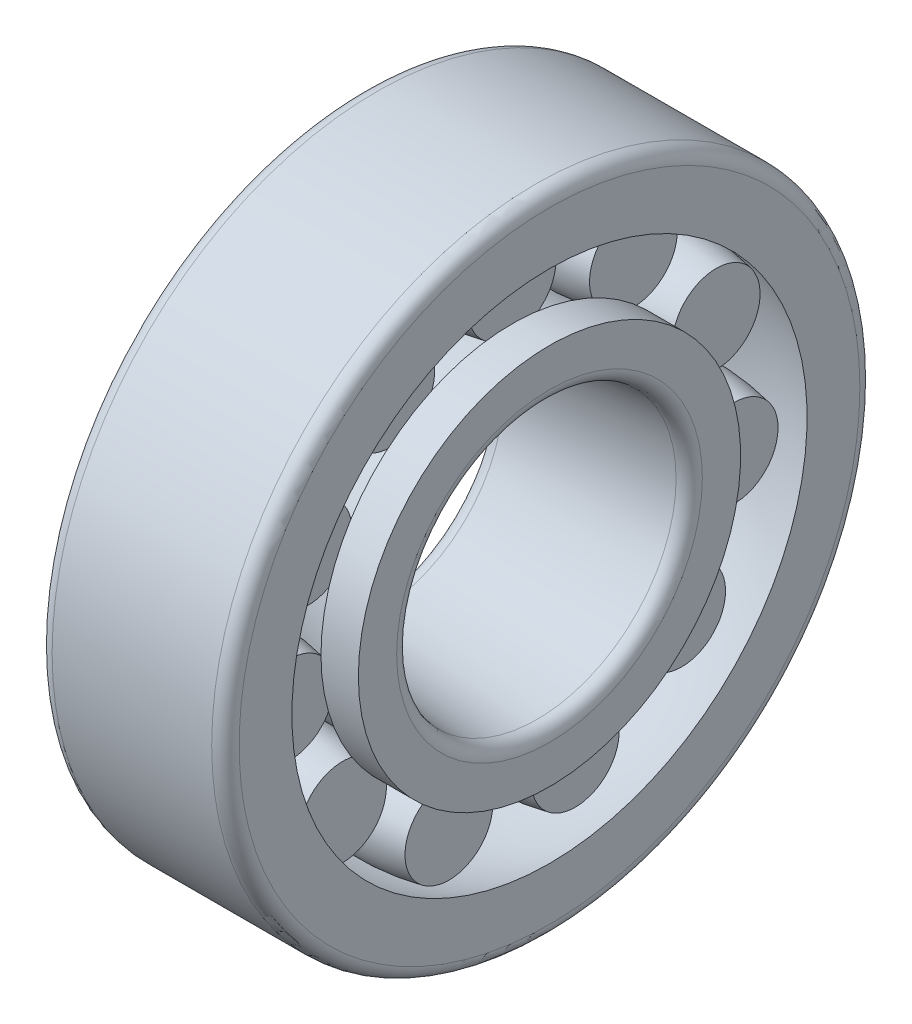
ISO-10303-21;
HEADER;
FILE_DESCRIPTION(('STEP AP214'),'2;1');
FILE_NAME('part.step','',(''),(''),'','','');
FILE_SCHEMA(('AUTOMOTIVE_DESIGN { 1 0 10303 214 1 1 1 1 }'));
ENDSEC;
DATA;
#1=APPLICATION_CONTEXT('core data for automotive mechanical design processes');
#2=APPLICATION_PROTOCOL_DEFINITION('international standard','automotive_design',2000,#1);
#3=PRODUCT_CONTEXT('',#1,'mechanical');
#4=PRODUCT('Part','Part','',(#3));
#5=PRODUCT_RELATED_PRODUCT_CATEGORY('part','',(#4));
#6=PRODUCT_DEFINITION_FORMATION('','',#4);
#7=PRODUCT_DEFINITION_CONTEXT('part definition',#1,'design');
#8=PRODUCT_DEFINITION('design','',#6,#7);
#9=PRODUCT_DEFINITION_SHAPE('','',#8);
#10=(LENGTH_UNIT() NAMED_UNIT(*) SI_UNIT(.MILLI.,.METRE.));
#11=(NAMED_UNIT(*) PLANE_ANGLE_UNIT() SI_UNIT($,.RADIAN.));
#12=(NAMED_UNIT(*) SI_UNIT($,.STERADIAN.) SOLID_ANGLE_UNIT());
#13=UNCERTAINTY_MEASURE_WITH_UNIT(LENGTH_MEASURE(1.E-05),#10,'distance_accuracy_value','');
#14=(GEOMETRIC_REPRESENTATION_CONTEXT(3) GLOBAL_UNCERTAINTY_ASSIGNED_CONTEXT((#13)) GLOBAL_UNIT_ASSIGNED_CONTEXT((#10,
#11,#12)) REPRESENTATION_CONTEXT('',''));
#15=CARTESIAN_POINT('',(0.,0.,0.));
#16=DIRECTION('',(0.,0.,1.));
#17=DIRECTION('',(1.,0.,0.));
#18=AXIS2_PLACEMENT_3D('',#15,#16,#17);
#19=CARTESIAN_POINT('',(3.00000000000001,12.1813372561274,-7.82847010423958));
#20=DIRECTION('',(1.,0.,0.));
#21=DIRECTION('',(0.,0.841253532831188,-0.540640817455586));
#22=AXIS2_PLACEMENT_3D('',#19,#20,#21);
#23=PLANE('',#22);
#24=CARTESIAN_POINT('',(3.00000000000001,15.1425635909614,-9.73153471420055));
#25=DIRECTION('',(1.,0.,0.));
#26=DIRECTION('',(0.,0.841253532831188,-0.540640817455586));
#27=AXIS2_PLACEMENT_3D('',#24,#25,#26);
#28=CIRCLE('',#27,3.52001652209197);
#29=CARTESIAN_POINT('',(3.00000000000001,18.1037899257954,-11.6345993241615));
#30=VERTEX_POINT('',#29);
#31=EDGE_CURVE('E11',#30,#30,#28,.T.);
#32=ORIENTED_EDGE('',*,*,#31,.F.);
#33=EDGE_LOOP('',(#32));
#34=FACE_BOUND('',#33,.T.);
#35=ADVANCED_FACE('F43',(#34),#23,.F.);
#36=CARTESIAN_POINT('',(7.5,15.1425635909614,-9.73153471420055));
#37=DIRECTION('',(1.,0.,0.));
#38=DIRECTION('',(0.,0.841253532831188,-0.540640817455586));
#39=AXIS2_PLACEMENT_3D('',#36,#37,#38);
#40=DEGENERATE_TOROIDAL_SURFACE('',#39,18.,21.9854750030813,.F.);
#41=CARTESIAN_POINT('',(12.,15.1425635909614,-9.73153471420055));
#42=DIRECTION('',(1.,0.,0.));
#43=DIRECTION('',(0.,0.841253532831188,-0.540640817455586));
#44=AXIS2_PLACEMENT_3D('',#41,#42,#43);
#45=CIRCLE('',#44,3.52001652209196);
#46=CARTESIAN_POINT('',(12.,18.1037899257954,-11.6345993241615));
#47=VERTEX_POINT('',#46);
#48=EDGE_CURVE('E49',#47,#47,#45,.T.);
#49=ORIENTED_EDGE('',*,*,#48,.F.);
#50=EDGE_LOOP('',(#49));
#51=FACE_BOUND('',#50,.T.);
#52=ORIENTED_EDGE('',*,*,#31,.T.);
#53=EDGE_LOOP('',(#52));
#54=FACE_BOUND('',#53,.T.);
#55=ADVANCED_FACE('F57',(#51,#54),#40,.F.);
#56=CARTESIAN_POINT('',(12.,12.1813372561274,-7.82847010423959));
#57=DIRECTION('',(-1.,0.,0.));
#58=DIRECTION('',(0.,-0.841253532831188,0.540640817455586));
#59=AXIS2_PLACEMENT_3D('',#56,#57,#58);
#60=PLANE('',#59);
#61=ORIENTED_EDGE('',*,*,#48,.T.);
#62=EDGE_LOOP('',(#61));
#63=FACE_BOUND('',#62,.T.);
#64=ADVANCED_FACE('F55',(#63),#60,.F.);
#65=CLOSED_SHELL('',(#35,#55,#64));
#66=MANIFOLD_SOLID_BREP('B2',#65);
#67=CARTESIAN_POINT('',(3.00000000000001,6.01520252474243,-13.1714562637099));
#68=DIRECTION('',(1.,0.,0.));
#69=DIRECTION('',(0.,0.415415013001897,-0.909631995354513));
#70=AXIS2_PLACEMENT_3D('',#67,#68,#69);
#71=PLANE('',#70);
#72=CARTESIAN_POINT('',(3.00000000000001,7.47747023403415,-16.3733759163812));
#73=DIRECTION('',(1.,0.,0.));
#74=DIRECTION('',(0.,0.415415013001897,-0.909631995354513));
#75=AXIS2_PLACEMENT_3D('',#72,#73,#74);
#76=CIRCLE('',#75,3.52001652209197);
#77=CARTESIAN_POINT('',(3.00000000000001,8.93973794332588,-19.5752955690526));
#78=VERTEX_POINT('',#77);
#79=EDGE_CURVE('E42',#78,#78,#76,.T.);
#80=ORIENTED_EDGE('',*,*,#79,.F.);
#81=EDGE_LOOP('',(#80));
#82=FACE_BOUND('',#81,.T.);
#83=ADVANCED_FACE('F97',(#82),#71,.F.);
#84=CARTESIAN_POINT('',(7.5,7.47747023403415,-16.3733759163812));
#85=DIRECTION('',(1.,0.,0.));
#86=DIRECTION('',(0.,0.415415013001897,-0.909631995354513));
#87=AXIS2_PLACEMENT_3D('',#84,#85,#86);
#88=DEGENERATE_TOROIDAL_SURFACE('',#87,18.,21.9854750030813,.F.);
#89=CARTESIAN_POINT('',(12.,7.47747023403415,-16.3733759163812));
#90=DIRECTION('',(1.,0.,0.));
#91=DIRECTION('',(0.,0.415415013001897,-0.909631995354513));
#92=AXIS2_PLACEMENT_3D('',#89,#90,#91);
#93=CIRCLE('',#92,3.52001652209196);
#94=CARTESIAN_POINT('',(12.,8.93973794332588,-19.5752955690526));
#95=VERTEX_POINT('',#94);
#96=EDGE_CURVE('E103',#95,#95,#93,.T.);
#97=ORIENTED_EDGE('',*,*,#96,.F.);
#98=EDGE_LOOP('',(#97));
#99=FACE_BOUND('',#98,.T.);
#100=ORIENTED_EDGE('',*,*,#79,.T.);
#101=EDGE_LOOP('',(#100));
#102=FACE_BOUND('',#101,.T.);
#103=ADVANCED_FACE('F111',(#99,#102),#88,.F.);
#104=CARTESIAN_POINT('',(12.,6.01520252474243,-13.1714562637099));
#105=DIRECTION('',(-1.,0.,0.));
#106=DIRECTION('',(0.,-0.415415013001897,0.909631995354513));
#107=AXIS2_PLACEMENT_3D('',#104,#105,#106);
#108=PLANE('',#107);
#109=ORIENTED_EDGE('',*,*,#96,.T.);
#110=EDGE_LOOP('',(#109));
#111=FACE_BOUND('',#110,.T.);
#112=ADVANCED_FACE('F109',(#111),#108,.F.);
#113=CLOSED_SHELL('',(#83,#103,#112));
#114=MANIFOLD_SOLID_BREP('B6',#113);
#115=CARTESIAN_POINT('',(3.00000000000001,-2.06071650685817,-14.332598124515));
#116=DIRECTION('',(1.,0.,0.));
#117=DIRECTION('',(0.,-0.142314838273275,-0.989821441880934));
#118=AXIS2_PLACEMENT_3D('',#115,#116,#117);
#119=PLANE('',#118);
#120=CARTESIAN_POINT('',(3.00000000000001,-2.56166708891894,-17.8167859538568));
#121=DIRECTION('',(1.,0.,0.));
#122=DIRECTION('',(0.,-0.142314838273275,-0.989821441880934));
#123=AXIS2_PLACEMENT_3D('',#120,#121,#122);
#124=CIRCLE('',#123,3.52001652209197);
#125=CARTESIAN_POINT('',(3.00000000000001,-3.06261767097972,-21.3009737831986));
#126=VERTEX_POINT('',#125);
#127=EDGE_CURVE('E96',#126,#126,#124,.T.);
#128=ORIENTED_EDGE('',*,*,#127,.F.);
#129=EDGE_LOOP('',(#128));
#130=FACE_BOUND('',#129,.T.);
#131=ADVANCED_FACE('F151',(#130),#119,.F.);
#132=CARTESIAN_POINT('',(7.5,-2.56166708891894,-17.8167859538568));
#133=DIRECTION('',(1.,0.,0.));
#134=DIRECTION('',(0.,-0.142314838273275,-0.989821441880934));
#135=AXIS2_PLACEMENT_3D('',#132,#133,#134);
#136=DEGENERATE_TOROIDAL_SURFACE('',#135,18.,21.9854750030813,.F.);
#137=CARTESIAN_POINT('',(12.,-2.56166708891894,-17.8167859538568));
#138=DIRECTION('',(1.,0.,0.));
#139=DIRECTION('',(0.,-0.142314838273275,-0.989821441880934));
#140=AXIS2_PLACEMENT_3D('',#137,#138,#139);
#141=CIRCLE('',#140,3.52001652209196);
#142=CARTESIAN_POINT('',(12.,-3.06261767097972,-21.3009737831986));
#143=VERTEX_POINT('',#142);
#144=EDGE_CURVE('E157',#143,#143,#141,.T.);
#145=ORIENTED_EDGE('',*,*,#144,.F.);
#146=EDGE_LOOP('',(#145));
#147=FACE_BOUND('',#146,.T.);
#148=ORIENTED_EDGE('',*,*,#127,.T.);
#149=EDGE_LOOP('',(#148));
#150=FACE_BOUND('',#149,.T.);
#151=ADVANCED_FACE('F165',(#147,#150),#136,.F.);
#152=CARTESIAN_POINT('',(12.,-2.06071650685817,-14.332598124515));
#153=DIRECTION('',(-1.,0.,0.));
#154=DIRECTION('',(0.,0.142314838273275,0.989821441880934));
#155=AXIS2_PLACEMENT_3D('',#152,#153,#154);
#156=PLANE('',#155);
#157=ORIENTED_EDGE('',*,*,#144,.T.);
#158=EDGE_LOOP('',(#157));
#159=FACE_BOUND('',#158,.T.);
#160=ADVANCED_FACE('F163',(#159),#156,.F.);
#161=CLOSED_SHELL('',(#131,#151,#160));
#162=MANIFOLD_SOLID_BREP('B37',#161);
#163=CARTESIAN_POINT('',(3.00000000000001,-9.48237260785836,-10.9432413500858));
#164=DIRECTION('',(1.,0.,0.));
#165=DIRECTION('',(0.,-0.654860733945278,-0.755749574354264));
#166=AXIS2_PLACEMENT_3D('',#163,#164,#165);
#167=PLANE('',#166);
#168=CARTESIAN_POINT('',(3.00000000000001,-11.787493211015,-13.6034923383768));
#169=DIRECTION('',(1.,0.,0.));
#170=DIRECTION('',(0.,-0.654860733945278,-0.755749574354264));
#171=AXIS2_PLACEMENT_3D('',#168,#169,#170);
#172=CIRCLE('',#171,3.52001652209197);
#173=CARTESIAN_POINT('',(3.00000000000001,-14.0926138141717,-16.2637433266677));
#174=VERTEX_POINT('',#173);
#175=EDGE_CURVE('E150',#174,#174,#172,.T.);
#176=ORIENTED_EDGE('',*,*,#175,.F.);
#177=EDGE_LOOP('',(#176));
#178=FACE_BOUND('',#177,.T.);
#179=ADVANCED_FACE('F205',(#178),#167,.F.);
#180=CARTESIAN_POINT('',(7.5,-11.787493211015,-13.6034923383768));
#181=DIRECTION('',(1.,0.,0.));
#182=DIRECTION('',(0.,-0.654860733945278,-0.755749574354264));
#183=AXIS2_PLACEMENT_3D('',#180,#181,#182);
#184=DEGENERATE_TOROIDAL_SURFACE('',#183,18.,21.9854750030813,.F.);
#185=CARTESIAN_POINT('',(12.,-11.787493211015,-13.6034923383768));
#186=DIRECTION('',(1.,0.,0.));
#187=DIRECTION('',(0.,-0.654860733945278,-0.755749574354264));
#188=AXIS2_PLACEMENT_3D('',#185,#186,#187);
#189=CIRCLE('',#188,3.52001652209196);
#190=CARTESIAN_POINT('',(12.,-14.0926138141717,-16.2637433266677));
#191=VERTEX_POINT('',#190);
#192=EDGE_CURVE('E211',#191,#191,#189,.T.);
#193=ORIENTED_EDGE('',*,*,#192,.F.);
#194=EDGE_LOOP('',(#193));
#195=FACE_BOUND('',#194,.T.);
#196=ORIENTED_EDGE('',*,*,#175,.T.);
#197=EDGE_LOOP('',(#196));
#198=FACE_BOUND('',#197,.T.);
#199=ADVANCED_FACE('F219',(#195,#198),#184,.F.);
#200=CARTESIAN_POINT('',(12.,-9.48237260785836,-10.9432413500858));
#201=DIRECTION('',(-1.,0.,0.));
#202=DIRECTION('',(0.,0.654860733945278,0.755749574354264));
#203=AXIS2_PLACEMENT_3D('',#200,#201,#202);
#204=PLANE('',#203);
#205=ORIENTED_EDGE('',*,*,#192,.T.);
#206=EDGE_LOOP('',(#205));
#207=FACE_BOUND('',#206,.T.);
#208=ADVANCED_FACE('F217',(#207),#204,.F.);
#209=CLOSED_SHELL('',(#179,#199,#208));
#210=MANIFOLD_SOLID_BREP('B91',#209);
#211=CARTESIAN_POINT('',(3.00000000000001,-13.8934424051067,-4.0794827682528));
#212=DIRECTION('',(1.,0.,0.));
#213=DIRECTION('',(0.,-0.959492973614495,-0.281732556841437));
#214=AXIS2_PLACEMENT_3D('',#211,#212,#213);
#215=PLANE('',#214);
#216=CARTESIAN_POINT('',(3.00000000000001,-17.2708735250609,-5.07118602314587));
#217=DIRECTION('',(1.,0.,0.));
#218=DIRECTION('',(0.,-0.959492973614495,-0.281732556841437));
#219=AXIS2_PLACEMENT_3D('',#216,#217,#218);
#220=CIRCLE('',#219,3.52001652209197);
#221=CARTESIAN_POINT('',(3.00000000000001,-20.6483046450151,-6.06288927803894));
#222=VERTEX_POINT('',#221);
#223=EDGE_CURVE('E204',#222,#222,#220,.T.);
#224=ORIENTED_EDGE('',*,*,#223,.F.);
#225=EDGE_LOOP('',(#224));
#226=FACE_BOUND('',#225,.T.);
#227=ADVANCED_FACE('F259',(#226),#215,.F.);
#228=CARTESIAN_POINT('',(7.5,-17.2708735250609,-5.07118602314587));
#229=DIRECTION('',(1.,0.,0.));
#230=DIRECTION('',(0.,-0.959492973614495,-0.281732556841437));
#231=AXIS2_PLACEMENT_3D('',#228,#229,#230);
#232=DEGENERATE_TOROIDAL_SURFACE('',#231,18.,21.9854750030813,.F.);
#233=CARTESIAN_POINT('',(12.,-17.2708735250609,-5.07118602314587));
#234=DIRECTION('',(1.,0.,0.));
#235=DIRECTION('',(0.,-0.959492973614495,-0.281732556841437));
#236=AXIS2_PLACEMENT_3D('',#233,#234,#235);
#237=CIRCLE('',#236,3.52001652209196);
#238=CARTESIAN_POINT('',(12.,-20.6483046450151,-6.06288927803894));
#239=VERTEX_POINT('',#238);
#240=EDGE_CURVE('E265',#239,#239,#237,.T.);
#241=ORIENTED_EDGE('',*,*,#240,.F.);
#242=EDGE_LOOP('',(#241));
#243=FACE_BOUND('',#242,.T.);
#244=ORIENTED_EDGE('',*,*,#223,.T.);
#245=EDGE_LOOP('',(#244));
#246=FACE_BOUND('',#245,.T.);
#247=ADVANCED_FACE('F273',(#243,#246),#232,.F.);
#248=CARTESIAN_POINT('',(12.,-13.8934424051067,-4.0794827682528));
#249=DIRECTION('',(-1.,0.,0.));
#250=DIRECTION('',(0.,0.959492973614495,0.281732556841437));
#251=AXIS2_PLACEMENT_3D('',#248,#249,#250);
#252=PLANE('',#251);
#253=ORIENTED_EDGE('',*,*,#240,.T.);
#254=EDGE_LOOP('',(#253));
#255=FACE_BOUND('',#254,.T.);
#256=ADVANCED_FACE('F271',(#255),#252,.F.);
#257=CLOSED_SHELL('',(#227,#247,#256));
#258=MANIFOLD_SOLID_BREP('B145',#257);
#259=CARTESIAN_POINT('',(3.00000000000001,-13.8934424051068,4.0794827682526));
#260=DIRECTION('',(1.,0.,0.));
#261=DIRECTION('',(0.,-0.959492973614499,0.281732556841423));
#262=AXIS2_PLACEMENT_3D('',#259,#260,#261);
#263=PLANE('',#262);
#264=CARTESIAN_POINT('',(3.00000000000001,-17.270873525061,5.07118602314562));
#265=DIRECTION('',(1.,0.,0.));
#266=DIRECTION('',(0.,-0.959492973614499,0.281732556841423));
#267=AXIS2_PLACEMENT_3D('',#264,#265,#266);
#268=CIRCLE('',#267,3.52001652209197);
#269=CARTESIAN_POINT('',(3.00000000000001,-20.6483046450152,6.06288927803864));
#270=VERTEX_POINT('',#269);
#271=EDGE_CURVE('E258',#270,#270,#268,.T.);
#272=ORIENTED_EDGE('',*,*,#271,.F.);
#273=EDGE_LOOP('',(#272));
#274=FACE_BOUND('',#273,.T.);
#275=ADVANCED_FACE('F313',(#274),#263,.F.);
#276=CARTESIAN_POINT('',(7.5,-17.270873525061,5.07118602314562));
#277=DIRECTION('',(1.,0.,0.));
#278=DIRECTION('',(0.,-0.959492973614499,0.281732556841423));
#279=AXIS2_PLACEMENT_3D('',#276,#277,#278);
#280=DEGENERATE_TOROIDAL_SURFACE('',#279,18.,21.9854750030813,.F.);
#281=CARTESIAN_POINT('',(12.,-17.270873525061,5.07118602314562));
#282=DIRECTION('',(1.,0.,0.));
#283=DIRECTION('',(0.,-0.959492973614499,0.281732556841423));
#284=AXIS2_PLACEMENT_3D('',#281,#282,#283);
#285=CIRCLE('',#284,3.52001652209196);
#286=CARTESIAN_POINT('',(12.,-20.6483046450152,6.06288927803864));
#287=VERTEX_POINT('',#286);
#288=EDGE_CURVE('E319',#287,#287,#285,.T.);
#289=ORIENTED_EDGE('',*,*,#288,.F.);
#290=EDGE_LOOP('',(#289));
#291=FACE_BOUND('',#290,.T.);
#292=ORIENTED_EDGE('',*,*,#271,.T.);
#293=EDGE_LOOP('',(#292));
#294=FACE_BOUND('',#293,.T.);
#295=ADVANCED_FACE('F327',(#291,#294),#280,.F.);
#296=CARTESIAN_POINT('',(12.,-13.8934424051068,4.0794827682526));
#297=DIRECTION('',(-1.,0.,0.));
#298=DIRECTION('',(0.,0.959492973614499,-0.281732556841423));
#299=AXIS2_PLACEMENT_3D('',#296,#297,#298);
#300=PLANE('',#299);
#301=ORIENTED_EDGE('',*,*,#288,.T.);
#302=EDGE_LOOP('',(#301));
#303=FACE_BOUND('',#302,.T.);
#304=ADVANCED_FACE('F325',(#303),#300,.F.);
#305=CLOSED_SHELL('',(#275,#295,#304));
#306=MANIFOLD_SOLID_BREP('B199',#305);
#307=CARTESIAN_POINT('',(3.00000000000001,-9.48237260785852,10.9432413500856));
#308=DIRECTION('',(1.,0.,0.));
#309=DIRECTION('',(0.,-0.654860733945289,0.755749574354255));
#310=AXIS2_PLACEMENT_3D('',#307,#308,#309);
#311=PLANE('',#310);
#312=CARTESIAN_POINT('',(3.00000000000001,-11.7874932110152,13.6034923383766));
#313=DIRECTION('',(1.,0.,0.));
#314=DIRECTION('',(0.,-0.654860733945289,0.755749574354255));
#315=AXIS2_PLACEMENT_3D('',#312,#313,#314);
#316=CIRCLE('',#315,3.52001652209197);
#317=CARTESIAN_POINT('',(3.00000000000001,-14.0926138141719,16.2637433266675));
#318=VERTEX_POINT('',#317);
#319=EDGE_CURVE('E312',#318,#318,#316,.T.);
#320=ORIENTED_EDGE('',*,*,#319,.F.);
#321=EDGE_LOOP('',(#320));
#322=FACE_BOUND('',#321,.T.);
#323=ADVANCED_FACE('F367',(#322),#311,.F.);
#324=CARTESIAN_POINT('',(7.5,-11.7874932110152,13.6034923383766));
#325=DIRECTION('',(1.,0.,0.));
#326=DIRECTION('',(0.,-0.654860733945289,0.755749574354255));
#327=AXIS2_PLACEMENT_3D('',#324,#325,#326);
#328=DEGENERATE_TOROIDAL_SURFACE('',#327,18.,21.9854750030813,.F.);
#329=CARTESIAN_POINT('',(12.,-11.7874932110152,13.6034923383766));
#330=DIRECTION('',(1.,0.,0.));
#331=DIRECTION('',(0.,-0.654860733945289,0.755749574354255));
#332=AXIS2_PLACEMENT_3D('',#329,#330,#331);
#333=CIRCLE('',#332,3.52001652209196);
#334=CARTESIAN_POINT('',(12.,-14.0926138141719,16.2637433266675));
#335=VERTEX_POINT('',#334);
#336=EDGE_CURVE('E373',#335,#335,#333,.T.);
#337=ORIENTED_EDGE('',*,*,#336,.F.);
#338=EDGE_LOOP('',(#337));
#339=FACE_BOUND('',#338,.T.);
#340=ORIENTED_EDGE('',*,*,#319,.T.);
#341=EDGE_LOOP('',(#340));
#342=FACE_BOUND('',#341,.T.);
#343=ADVANCED_FACE('F381',(#339,#342),#328,.F.);
#344=CARTESIAN_POINT('',(12.,-9.48237260785852,10.9432413500856));
#345=DIRECTION('',(-1.,0.,0.));
#346=DIRECTION('',(0.,0.654860733945289,-0.755749574354255));
#347=AXIS2_PLACEMENT_3D('',#344,#345,#346);
#348=PLANE('',#347);
#349=ORIENTED_EDGE('',*,*,#336,.T.);
#350=EDGE_LOOP('',(#349));
#351=FACE_BOUND('',#350,.T.);
#352=ADVANCED_FACE('F379',(#351),#348,.F.);
#353=CLOSED_SHELL('',(#323,#343,#352));
#354=MANIFOLD_SOLID_BREP('B253',#353);
#355=CARTESIAN_POINT('',(3.00000000000001,-2.06071650685838,14.332598124515));
#356=DIRECTION('',(1.,0.,0.));
#357=DIRECTION('',(0.,-0.142314838273289,0.989821441880932));
#358=AXIS2_PLACEMENT_3D('',#355,#356,#357);
#359=PLANE('',#358);
#360=CARTESIAN_POINT('',(3.00000000000001,-2.5616670889192,17.8167859538568));
#361=DIRECTION('',(1.,0.,0.));
#362=DIRECTION('',(0.,-0.142314838273289,0.989821441880932));
#363=AXIS2_PLACEMENT_3D('',#360,#361,#362);
#364=CIRCLE('',#363,3.52001652209197);
#365=CARTESIAN_POINT('',(3.00000000000001,-3.06261767098002,21.3009737831986));
#366=VERTEX_POINT('',#365);
#367=EDGE_CURVE('E366',#366,#366,#364,.T.);
#368=ORIENTED_EDGE('',*,*,#367,.F.);
#369=EDGE_LOOP('',(#368));
#370=FACE_BOUND('',#369,.T.);
#371=ADVANCED_FACE('F421',(#370),#359,.F.);
#372=CARTESIAN_POINT('',(7.5,-2.5616670889192,17.8167859538568));
#373=DIRECTION('',(1.,0.,0.));
#374=DIRECTION('',(0.,-0.142314838273289,0.989821441880932));
#375=AXIS2_PLACEMENT_3D('',#372,#373,#374);
#376=DEGENERATE_TOROIDAL_SURFACE('',#375,18.,21.9854750030813,.F.);
#377=CARTESIAN_POINT('',(12.,-2.5616670889192,17.8167859538568));
#378=DIRECTION('',(1.,0.,0.));
#379=DIRECTION('',(0.,-0.142314838273289,0.989821441880932));
#380=AXIS2_PLACEMENT_3D('',#377,#378,#379);
#381=CIRCLE('',#380,3.52001652209196);
#382=CARTESIAN_POINT('',(12.,-3.06261767098002,21.3009737831986));
#383=VERTEX_POINT('',#382);
#384=EDGE_CURVE('E427',#383,#383,#381,.T.);
#385=ORIENTED_EDGE('',*,*,#384,.F.);
#386=EDGE_LOOP('',(#385));
#387=FACE_BOUND('',#386,.T.);
#388=ORIENTED_EDGE('',*,*,#367,.T.);
#389=EDGE_LOOP('',(#388));
#390=FACE_BOUND('',#389,.T.);
#391=ADVANCED_FACE('F435',(#387,#390),#376,.F.);
#392=CARTESIAN_POINT('',(12.,-2.06071650685838,14.332598124515));
#393=DIRECTION('',(-1.,0.,0.));
#394=DIRECTION('',(0.,0.142314838273289,-0.989821441880932));
#395=AXIS2_PLACEMENT_3D('',#392,#393,#394);
#396=PLANE('',#395);
#397=ORIENTED_EDGE('',*,*,#384,.T.);
#398=EDGE_LOOP('',(#397));
#399=FACE_BOUND('',#398,.T.);
#400=ADVANCED_FACE('F433',(#399),#396,.F.);
#401=CLOSED_SHELL('',(#371,#391,#400));
#402=MANIFOLD_SOLID_BREP('B307',#401);
#403=CARTESIAN_POINT('',(3.00000000000001,6.01520252474223,13.17145626371));
#404=DIRECTION('',(1.,0.,0.));
#405=DIRECTION('',(0.,0.415415013001884,0.909631995354519));
#406=AXIS2_PLACEMENT_3D('',#403,#404,#405);
#407=PLANE('',#406);
#408=CARTESIAN_POINT('',(3.00000000000001,7.47747023403391,16.3733759163813));
#409=DIRECTION('',(1.,0.,0.));
#410=DIRECTION('',(0.,0.415415013001884,0.909631995354519));
#411=AXIS2_PLACEMENT_3D('',#408,#409,#410);
#412=CIRCLE('',#411,3.52001652209197);
#413=CARTESIAN_POINT('',(3.00000000000001,8.93973794332559,19.5752955690527));
#414=VERTEX_POINT('',#413);
#415=EDGE_CURVE('E420',#414,#414,#412,.T.);
#416=ORIENTED_EDGE('',*,*,#415,.F.);
#417=EDGE_LOOP('',(#416));
#418=FACE_BOUND('',#417,.T.);
#419=ADVANCED_FACE('F475',(#418),#407,.F.);
#420=CARTESIAN_POINT('',(7.5,7.47747023403391,16.3733759163814));
#421=DIRECTION('',(1.,0.,0.));
#422=DIRECTION('',(0.,0.415415013001884,0.909631995354519));
#423=AXIS2_PLACEMENT_3D('',#420,#421,#422);
#424=DEGENERATE_TOROIDAL_SURFACE('',#423,18.,21.9854750030813,.F.);
#425=CARTESIAN_POINT('',(12.,7.47747023403391,16.3733759163814));
#426=DIRECTION('',(1.,0.,0.));
#427=DIRECTION('',(0.,0.415415013001884,0.909631995354519));
#428=AXIS2_PLACEMENT_3D('',#425,#426,#427);
#429=CIRCLE('',#428,3.52001652209196);
#430=CARTESIAN_POINT('',(12.,8.93973794332559,19.5752955690527));
#431=VERTEX_POINT('',#430);
#432=EDGE_CURVE('E481',#431,#431,#429,.T.);
#433=ORIENTED_EDGE('',*,*,#432,.F.);
#434=EDGE_LOOP('',(#433));
#435=FACE_BOUND('',#434,.T.);
#436=ORIENTED_EDGE('',*,*,#415,.T.);
#437=EDGE_LOOP('',(#436));
#438=FACE_BOUND('',#437,.T.);
#439=ADVANCED_FACE('F489',(#435,#438),#424,.F.);
#440=CARTESIAN_POINT('',(12.,6.01520252474223,13.17145626371));
#441=DIRECTION('',(-1.,0.,0.));
#442=DIRECTION('',(0.,-0.415415013001884,-0.909631995354519));
#443=AXIS2_PLACEMENT_3D('',#440,#441,#442);
#444=PLANE('',#443);
#445=ORIENTED_EDGE('',*,*,#432,.T.);
#446=EDGE_LOOP('',(#445));
#447=FACE_BOUND('',#446,.T.);
#448=ADVANCED_FACE('F487',(#447),#444,.F.);
#449=CLOSED_SHELL('',(#419,#439,#448));
#450=MANIFOLD_SOLID_BREP('B361',#449);
#451=CARTESIAN_POINT('',(3.00000000000001,12.1813372561273,7.82847010423976));
#452=DIRECTION('',(1.,0.,0.));
#453=DIRECTION('',(0.,0.841253532831181,0.540640817455599));
#454=AXIS2_PLACEMENT_3D('',#451,#452,#453);
#455=PLANE('',#454);
#456=CARTESIAN_POINT('',(3.00000000000001,15.1425635909613,9.73153471420078));
#457=DIRECTION('',(1.,0.,0.));
#458=DIRECTION('',(0.,0.841253532831181,0.540640817455599));
#459=AXIS2_PLACEMENT_3D('',#456,#457,#458);
#460=CIRCLE('',#459,3.52001652209197);
#461=CARTESIAN_POINT('',(3.00000000000001,18.1037899257952,11.6345993241618));
#462=VERTEX_POINT('',#461);
#463=EDGE_CURVE('E474',#462,#462,#460,.T.);
#464=ORIENTED_EDGE('',*,*,#463,.F.);
#465=EDGE_LOOP('',(#464));
#466=FACE_BOUND('',#465,.T.);
#467=ADVANCED_FACE('F529',(#466),#455,.F.);
#468=CARTESIAN_POINT('',(7.5,15.1425635909613,9.73153471420078));
#469=DIRECTION('',(1.,0.,0.));
#470=DIRECTION('',(0.,0.841253532831181,0.540640817455599));
#471=AXIS2_PLACEMENT_3D('',#468,#469,#470);
#472=DEGENERATE_TOROIDAL_SURFACE('',#471,18.,21.9854750030813,.F.);
#473=CARTESIAN_POINT('',(12.,15.1425635909613,9.73153471420078));
#474=DIRECTION('',(1.,0.,0.));
#475=DIRECTION('',(0.,0.841253532831181,0.540640817455599));
#476=AXIS2_PLACEMENT_3D('',#473,#474,#475);
#477=CIRCLE('',#476,3.52001652209196);
#478=CARTESIAN_POINT('',(12.,18.1037899257952,11.6345993241618));
#479=VERTEX_POINT('',#478);
#480=EDGE_CURVE('E535',#479,#479,#477,.T.);
#481=ORIENTED_EDGE('',*,*,#480,.F.);
#482=EDGE_LOOP('',(#481));
#483=FACE_BOUND('',#482,.T.);
#484=ORIENTED_EDGE('',*,*,#463,.T.);
#485=EDGE_LOOP('',(#484));
#486=FACE_BOUND('',#485,.T.);
#487=ADVANCED_FACE('F543',(#483,#486),#472,.F.);
#488=CARTESIAN_POINT('',(12.,12.1813372561273,7.82847010423976));
#489=DIRECTION('',(-1.,0.,0.));
#490=DIRECTION('',(0.,-0.841253532831181,-0.540640817455599));
#491=AXIS2_PLACEMENT_3D('',#488,#489,#490);
#492=PLANE('',#491);
#493=ORIENTED_EDGE('',*,*,#480,.T.);
#494=EDGE_LOOP('',(#493));
#495=FACE_BOUND('',#494,.T.);
#496=ADVANCED_FACE('F541',(#495),#492,.F.);
#497=CLOSED_SHELL('',(#467,#487,#496));
#498=MANIFOLD_SOLID_BREP('B415',#497);
#499=CARTESIAN_POINT('',(3.00000000000001,14.479983477908,0.));
#500=DIRECTION('',(1.,0.,0.));
#501=DIRECTION('',(0.,1.,0.));
#502=AXIS2_PLACEMENT_3D('',#499,#500,#501);
#503=PLANE('',#502);
#504=CARTESIAN_POINT('',(3.00000000000001,18.,0.));
#505=DIRECTION('',(1.,0.,0.));
#506=DIRECTION('',(0.,1.,0.));
#507=AXIS2_PLACEMENT_3D('',#504,#505,#506);
#508=CIRCLE('',#507,3.52001652209197);
#509=CARTESIAN_POINT('',(3.00000000000001,21.520016522092,0.));
#510=VERTEX_POINT('',#509);
#511=EDGE_CURVE('E528',#510,#510,#508,.T.);
#512=ORIENTED_EDGE('',*,*,#511,.F.);
#513=EDGE_LOOP('',(#512));
#514=FACE_BOUND('',#513,.T.);
#515=ADVANCED_FACE('F583',(#514),#503,.F.);
#516=CARTESIAN_POINT('',(7.5,18.,0.));
#517=DIRECTION('',(1.,0.,0.));
#518=DIRECTION('',(0.,1.,0.));
#519=AXIS2_PLACEMENT_3D('',#516,#517,#518);
#520=DEGENERATE_TOROIDAL_SURFACE('',#519,18.,21.9854750030813,.F.);
#521=CARTESIAN_POINT('',(12.,18.,0.));
#522=DIRECTION('',(1.,0.,0.));
#523=DIRECTION('',(0.,1.,0.));
#524=AXIS2_PLACEMENT_3D('',#521,#522,#523);
#525=CIRCLE('',#524,3.52001652209196);
#526=CARTESIAN_POINT('',(12.,21.520016522092,0.));
#527=VERTEX_POINT('',#526);
#528=EDGE_CURVE('E589',#527,#527,#525,.T.);
#529=ORIENTED_EDGE('',*,*,#528,.F.);
#530=EDGE_LOOP('',(#529));
#531=FACE_BOUND('',#530,.T.);
#532=ORIENTED_EDGE('',*,*,#511,.T.);
#533=EDGE_LOOP('',(#532));
#534=FACE_BOUND('',#533,.T.);
#535=ADVANCED_FACE('F597',(#531,#534),#520,.F.);
#536=CARTESIAN_POINT('',(12.,14.479983477908,0.));
#537=DIRECTION('',(-1.,0.,0.));
#538=DIRECTION('',(0.,-1.,0.));
#539=AXIS2_PLACEMENT_3D('',#536,#537,#538);
#540=PLANE('',#539);
#541=ORIENTED_EDGE('',*,*,#528,.T.);
#542=EDGE_LOOP('',(#541));
#543=FACE_BOUND('',#542,.T.);
#544=ADVANCED_FACE('F595',(#543),#540,.F.);
#545=CLOSED_SHELL('',(#515,#535,#544));
#546=MANIFOLD_SOLID_BREP('B469',#545);
#547=CARTESIAN_POINT('',(7.5,0.,0.));
#548=DIRECTION('',(-1.,0.,0.));
#549=DIRECTION('',(0.,0.,1.));
#550=AXIS2_PLACEMENT_3D('',#547,#548,#549);
#551=TOROIDAL_SURFACE('',#550,36.,21.9854750030813);
#552=CARTESIAN_POINT('',(12.,0.,0.));
#553=DIRECTION('',(-1.,0.,0.));
#554=DIRECTION('',(0.,0.,1.));
#555=AXIS2_PLACEMENT_3D('',#552,#553,#554);
#556=CIRCLE('',#555,14.479983477908);
#557=CARTESIAN_POINT('',(12.,0.,14.479983477908));
#558=VERTEX_POINT('',#557);
#559=EDGE_CURVE('E665',#558,#558,#556,.T.);
#560=ORIENTED_EDGE('',*,*,#559,.T.);
#561=EDGE_LOOP('',(#560));
#562=FACE_BOUND('',#561,.T.);
#563=CARTESIAN_POINT('',(3.,0.,0.));
#564=DIRECTION('',(-1.,0.,0.));
#565=DIRECTION('',(0.,0.,1.));
#566=AXIS2_PLACEMENT_3D('',#563,#564,#565);
#567=CIRCLE('',#566,14.479983477908);
#568=CARTESIAN_POINT('',(3.,0.,14.479983477908));
#569=VERTEX_POINT('',#568);
#570=EDGE_CURVE('E650',#569,#569,#567,.T.);
#571=ORIENTED_EDGE('',*,*,#570,.F.);
#572=EDGE_LOOP('',(#571));
#573=FACE_BOUND('',#572,.T.);
#574=ADVANCED_FACE('F630',(#562,#573),#551,.F.);
#575=CARTESIAN_POINT('',(3.,0.,0.));
#576=DIRECTION('',(1.,0.,0.));
#577=DIRECTION('',(0.,0.,-1.));
#578=AXIS2_PLACEMENT_3D('',#575,#576,#577);
#579=PLANE('',#578);
#580=ORIENTED_EDGE('',*,*,#570,.T.);
#581=EDGE_LOOP('',(#580));
#582=FACE_BOUND('',#581,.T.);
#583=CARTESIAN_POINT('',(3.,0.,0.));
#584=DIRECTION('',(-1.,0.,0.));
#585=DIRECTION('',(0.,0.,1.));
#586=AXIS2_PLACEMENT_3D('',#583,#584,#585);
#587=CIRCLE('',#586,15.3333333333333);
#588=CARTESIAN_POINT('',(3.,0.,15.3333333333333));
#589=VERTEX_POINT('',#588);
#590=EDGE_CURVE('E653',#589,#589,#587,.T.);
#591=ORIENTED_EDGE('',*,*,#590,.F.);
#592=EDGE_LOOP('',(#591));
#593=FACE_BOUND('',#592,.T.);
#594=ADVANCED_FACE('F689',(#582,#593),#579,.T.);
#595=CARTESIAN_POINT('',(0.,0.,0.));
#596=DIRECTION('',(-1.,0.,0.));
#597=DIRECTION('',(0.,0.,1.));
#598=AXIS2_PLACEMENT_3D('',#595,#596,#597);
#599=CYLINDRICAL_SURFACE('',#598,15.3333333333333);
#600=ORIENTED_EDGE('',*,*,#590,.T.);
#601=EDGE_LOOP('',(#600));
#602=FACE_BOUND('',#601,.T.);
#603=CARTESIAN_POINT('',(0.,0.,0.));
#604=DIRECTION('',(-1.,0.,0.));
#605=DIRECTION('',(0.,0.,1.));
#606=AXIS2_PLACEMENT_3D('',#603,#604,#605);
#607=CIRCLE('',#606,15.3333333333333);
#608=CARTESIAN_POINT('',(0.,0.,15.3333333333333));
#609=VERTEX_POINT('',#608);
#610=EDGE_CURVE('E656',#609,#609,#607,.T.);
#611=ORIENTED_EDGE('',*,*,#610,.F.);
#612=EDGE_LOOP('',(#611));
#613=FACE_BOUND('',#612,.T.);
#614=ADVANCED_FACE('F694',(#602,#613),#599,.T.);
#615=CARTESIAN_POINT('',(0.,0.,0.));
#616=DIRECTION('',(-1.,0.,0.));
#617=DIRECTION('',(0.,0.,1.));
#618=AXIS2_PLACEMENT_3D('',#615,#616,#617);
#619=PLANE('',#618);
#620=CARTESIAN_POINT('',(0.,0.,0.));
#621=DIRECTION('',(-1.,0.,0.));
#622=DIRECTION('',(0.,0.,1.));
#623=AXIS2_PLACEMENT_3D('',#620,#621,#622);
#624=CIRCLE('',#623,11.195479503056);
#625=CARTESIAN_POINT('',(0.,0.,11.195479503056));
#626=VERTEX_POINT('',#625);
#627=EDGE_CURVE('E637',#626,#626,#624,.F.);
#628=ORIENTED_EDGE('',*,*,#627,.T.);
#629=EDGE_LOOP('',(#628));
#630=FACE_BOUND('',#629,.T.);
#631=ORIENTED_EDGE('',*,*,#610,.T.);
#632=EDGE_LOOP('',(#631));
#633=FACE_BOUND('',#632,.T.);
#634=ADVANCED_FACE('F700',(#630,#633),#619,.T.);
#635=CARTESIAN_POINT('',(0.,0.,0.));
#636=DIRECTION('',(1.,0.,0.));
#637=DIRECTION('',(0.,0.,1.));
#638=AXIS2_PLACEMENT_3D('',#635,#636,#637);
#639=CONICAL_SURFACE('',#638,10.,0.0831412318884414);
#640=CARTESIAN_POINT('',(1.19135002783913,0.,0.));
#641=DIRECTION('',(-1.,0.,0.));
#642=DIRECTION('',(0.,0.,1.));
#643=AXIS2_PLACEMENT_3D('',#640,#641,#642);
#644=CIRCLE('',#643,10.0992791689866);
#645=CARTESIAN_POINT('',(1.19135002783913,0.,10.0992791689866));
#646=VERTEX_POINT('',#645);
#647=EDGE_CURVE('E641',#646,#646,#644,.T.);
#648=ORIENTED_EDGE('',*,*,#647,.T.);
#649=EDGE_LOOP('',(#648));
#650=FACE_BOUND('',#649,.T.);
#651=CARTESIAN_POINT('',(13.9913500278391,0.,0.));
#652=DIRECTION('',(-1.,0.,0.));
#653=DIRECTION('',(0.,0.,1.));
#654=AXIS2_PLACEMENT_3D('',#651,#652,#653);
#655=CIRCLE('',#654,11.1659458356533);
#656=CARTESIAN_POINT('',(13.9913500278391,0.,11.1659458356533));
#657=VERTEX_POINT('',#656);
#658=EDGE_CURVE('E645',#657,#657,#655,.F.);
#659=ORIENTED_EDGE('',*,*,#658,.T.);
#660=EDGE_LOOP('',(#659));
#661=FACE_BOUND('',#660,.T.);
#662=ADVANCED_FACE('F686',(#650,#661),#639,.F.);
#663=CARTESIAN_POINT('',(15.,0.,0.));
#664=DIRECTION('',(1.,0.,0.));
#665=DIRECTION('',(0.,0.,-1.));
#666=AXIS2_PLACEMENT_3D('',#663,#664,#665);
#667=PLANE('',#666);
#668=CARTESIAN_POINT('',(15.,0.,0.));
#669=DIRECTION('',(1.,0.,0.));
#670=DIRECTION('',(0.,0.,-1.));
#671=AXIS2_PLACEMENT_3D('',#668,#669,#670);
#672=CIRCLE('',#671,12.2621461697226);
#673=CARTESIAN_POINT('',(15.,0.,-12.2621461697226));
#674=VERTEX_POINT('',#673);
#675=EDGE_CURVE('E582',#674,#674,#672,.F.);
#676=ORIENTED_EDGE('',*,*,#675,.T.);
#677=EDGE_LOOP('',(#676));
#678=FACE_BOUND('',#677,.T.);
#679=CARTESIAN_POINT('',(15.,0.,0.));
#680=DIRECTION('',(-1.,0.,0.));
#681=DIRECTION('',(0.,0.,1.));
#682=AXIS2_PLACEMENT_3D('',#679,#680,#681);
#683=CIRCLE('',#682,15.3333333333333);
#684=CARTESIAN_POINT('',(15.,0.,15.3333333333333));
#685=VERTEX_POINT('',#684);
#686=EDGE_CURVE('E659',#685,#685,#683,.T.);
#687=ORIENTED_EDGE('',*,*,#686,.F.);
#688=EDGE_LOOP('',(#687));
#689=FACE_BOUND('',#688,.T.);
#690=ADVANCED_FACE('F680',(#678,#689),#667,.T.);
#691=CARTESIAN_POINT('',(0.,0.,0.));
#692=DIRECTION('',(-1.,0.,0.));
#693=DIRECTION('',(0.,0.,1.));
#694=AXIS2_PLACEMENT_3D('',#691,#692,#693);
#695=CYLINDRICAL_SURFACE('',#694,15.3333333333333);
#696=ORIENTED_EDGE('',*,*,#686,.T.);
#697=EDGE_LOOP('',(#696));
#698=FACE_BOUND('',#697,.T.);
#699=CARTESIAN_POINT('',(12.,0.,0.));
#700=DIRECTION('',(-1.,0.,0.));
#701=DIRECTION('',(0.,0.,1.));
#702=AXIS2_PLACEMENT_3D('',#699,#700,#701);
#703=CIRCLE('',#702,15.3333333333333);
#704=CARTESIAN_POINT('',(12.,0.,15.3333333333333));
#705=VERTEX_POINT('',#704);
#706=EDGE_CURVE('E662',#705,#705,#703,.T.);
#707=ORIENTED_EDGE('',*,*,#706,.F.);
#708=EDGE_LOOP('',(#707));
#709=FACE_BOUND('',#708,.T.);
#710=ADVANCED_FACE('F675',(#698,#709),#695,.T.);
#711=CARTESIAN_POINT('',(12.,0.,0.));
#712=DIRECTION('',(1.,0.,0.));
#713=DIRECTION('',(0.,0.,-1.));
#714=AXIS2_PLACEMENT_3D('',#711,#712,#713);
#715=PLANE('',#714);
#716=ORIENTED_EDGE('',*,*,#559,.F.);
#717=EDGE_LOOP('',(#716));
#718=FACE_BOUND('',#717,.T.);
#719=ORIENTED_EDGE('',*,*,#706,.T.);
#720=EDGE_LOOP('',(#719));
#721=FACE_BOUND('',#720,.T.);
#722=ADVANCED_FACE('F671',(#718,#721),#715,.F.);
#723=CARTESIAN_POINT('',(1.1,0.,0.));
#724=DIRECTION('',(-1.,0.,0.));
#725=DIRECTION('',(0.,0.,1.));
#726=AXIS2_PLACEMENT_3D('',#723,#724,#725);
#727=TOROIDAL_SURFACE('',#726,11.195479503056,1.1);
#728=ORIENTED_EDGE('',*,*,#627,.F.);
#729=EDGE_LOOP('',(#728));
#730=FACE_BOUND('',#729,.T.);
#731=ORIENTED_EDGE('',*,*,#647,.F.);
#732=EDGE_LOOP('',(#731));
#733=FACE_BOUND('',#732,.T.);
#734=ADVANCED_FACE('F674',(#730,#733),#727,.T.);
#735=CARTESIAN_POINT('',(13.9,0.,0.));
#736=DIRECTION('',(1.,0.,0.));
#737=DIRECTION('',(0.,0.,-1.));
#738=AXIS2_PLACEMENT_3D('',#735,#736,#737);
#739=TOROIDAL_SURFACE('',#738,12.2621461697226,1.1);
#740=ORIENTED_EDGE('',*,*,#658,.F.);
#741=EDGE_LOOP('',(#740));
#742=FACE_BOUND('',#741,.T.);
#743=ORIENTED_EDGE('',*,*,#675,.F.);
#744=EDGE_LOOP('',(#743));
#745=FACE_BOUND('',#744,.T.);
#746=ADVANCED_FACE('F632',(#742,#745),#739,.T.);
#747=CLOSED_SHELL('',(#574,#594,#614,#634,#662,#690,#710,#722,#734,#746));
#748=MANIFOLD_SOLID_BREP('B523',#747);
#749=CARTESIAN_POINT('',(0.,0.,0.));
#750=DIRECTION('',(-1.,0.,0.));
#751=DIRECTION('',(0.,0.,1.));
#752=AXIS2_PLACEMENT_3D('',#749,#750,#751);
#753=PLANE('',#752);
#754=CARTESIAN_POINT('',(0.,0.,0.));
#755=DIRECTION('',(-1.,0.,0.));
#756=DIRECTION('',(0.,0.,1.));
#757=AXIS2_PLACEMENT_3D('',#754,#755,#756);
#758=CIRCLE('',#757,24.9);
#759=CARTESIAN_POINT('',(0.,0.,24.9));
#760=VERTEX_POINT('',#759);
#761=EDGE_CURVE('E629',#760,#760,#758,.T.);
#762=ORIENTED_EDGE('',*,*,#761,.T.);
#763=EDGE_LOOP('',(#762));
#764=FACE_BOUND('',#763,.T.);
#765=CARTESIAN_POINT('',(0.,0.,0.));
#766=DIRECTION('',(-1.,0.,0.));
#767=DIRECTION('',(0.,0.,1.));
#768=AXIS2_PLACEMENT_3D('',#765,#766,#767);
#769=CIRCLE('',#768,20.6666666666667);
#770=CARTESIAN_POINT('',(0.,20.6666666666667,0.));
#771=VERTEX_POINT('',#770);
#772=EDGE_CURVE('E801',#771,#771,#769,.T.);
#773=ORIENTED_EDGE('',*,*,#772,.F.);
#774=EDGE_LOOP('',(#773));
#775=FACE_BOUND('',#774,.T.);
#776=ADVANCED_FACE('F781',(#764,#775),#753,.T.);
#777=CARTESIAN_POINT('',(7.5,0.,0.));
#778=DIRECTION('',(-1.,0.,0.));
#779=DIRECTION('',(0.,1.,0.));
#780=AXIS2_PLACEMENT_3D('',#777,#778,#779);
#781=SPHERICAL_SURFACE('',#780,21.9854750030813);
#782=CARTESIAN_POINT('',(15.,0.,0.));
#783=DIRECTION('',(-1.,0.,0.));
#784=DIRECTION('',(0.,0.,1.));
#785=AXIS2_PLACEMENT_3D('',#782,#783,#784);
#786=CIRCLE('',#785,20.6666666666667);
#787=CARTESIAN_POINT('',(15.,20.6666666666667,0.));
#788=VERTEX_POINT('',#787);
#789=EDGE_CURVE('E804',#788,#788,#786,.T.);
#790=CARTESIAN_POINT('',(15.,20.6666666666667,0.));
#791=CARTESIAN_POINT('',(14.8501136587083,20.7210612170687,0.));
#792=CARTESIAN_POINT('',(14.6996353829681,20.7738246266375,0.));
#793=CARTESIAN_POINT('',(14.3975666111159,20.8760654138229,0.));
#794=CARTESIAN_POINT('',(14.2459761150039,20.9255427914396,0.));
#795=CARTESIAN_POINT('',(13.9417545509331,21.0211877644351,0.));
#796=CARTESIAN_POINT('',(13.7891234829744,21.067355359814,0.));
#797=CARTESIAN_POINT('',(13.4828930573961,21.156359001636,0.));
#798=CARTESIAN_POINT('',(13.3292936997767,21.199195048079,0.));
#799=CARTESIAN_POINT('',(13.02119939763,21.2815152907344,0.));
#800=CARTESIAN_POINT('',(12.8667044531028,21.3209994869468,0.));
#801=CARTESIAN_POINT('',(12.5568921139747,21.3965973444675,0.));
#802=CARTESIAN_POINT('',(12.4015747193738,21.4327110057759,0.));
#803=CARTESIAN_POINT('',(12.0901910035491,21.5015506963379,0.));
#804=CARTESIAN_POINT('',(11.9341246823253,21.5342767255915,0.));
#805=CARTESIAN_POINT('',(11.6213169919591,21.5963256606766,0.));
#806=CARTESIAN_POINT('',(11.4645756228167,21.625648566508,0.));
#807=CARTESIAN_POINT('',(11.1504920346763,21.6808773737732,0.));
#808=CARTESIAN_POINT('',(10.9931498156784,21.7067832752069,0.));
#809=CARTESIAN_POINT('',(10.677939010372,21.7551658103943,0.));
#810=CARTESIAN_POINT('',(10.5200704240636,21.777642444148,0.));
#811=CARTESIAN_POINT('',(10.2038816158389,21.8191558039957,0.));
#812=CARTESIAN_POINT('',(10.0455613939225,21.8381925300896,0.));
#813=CARTESIAN_POINT('',(9.7285442599829,21.87281706303,0.));
#814=CARTESIAN_POINT('',(9.56984734795967,21.8884048698764,0.));
#815=CARTESIAN_POINT('',(9.2521519576237,21.9161241853773,0.));
#816=CARTESIAN_POINT('',(9.09315347931097,21.9282556940319,0.));
#817=CARTESIAN_POINT('',(8.77493022296886,21.9490566703456,0.));
#818=CARTESIAN_POINT('',(8.61570544493948,21.9577261380047,0.));
#819=CARTESIAN_POINT('',(8.29710496286243,21.9715989283817,0.));
#820=CARTESIAN_POINT('',(8.13772925881475,21.9768022510996,0.));
#821=CARTESIAN_POINT('',(7.81890236984471,21.9837402884494,0.));
#822=CARTESIAN_POINT('',(7.65945118492236,21.9854750030813,0.));
#823=CARTESIAN_POINT('',(7.34054881507764,21.9854750030813,0.));
#824=CARTESIAN_POINT('',(7.18109763015528,21.9837402884494,0.));
#825=CARTESIAN_POINT('',(6.86227074118525,21.9768022510996,0.));
#826=CARTESIAN_POINT('',(6.70289503713758,21.9715989283817,0.));
#827=CARTESIAN_POINT('',(6.38429455506052,21.9577261380047,0.));
#828=CARTESIAN_POINT('',(6.22506977703114,21.9490566703456,0.));
#829=CARTESIAN_POINT('',(5.90684652068903,21.9282556940319,0.));
#830=CARTESIAN_POINT('',(5.7478480423763,21.9161241853773,0.));
#831=CARTESIAN_POINT('',(5.43015265204033,21.8884048698764,0.));
#832=CARTESIAN_POINT('',(5.2714557400171,21.87281706303,0.));
#833=CARTESIAN_POINT('',(4.9544386060775,21.8381925300896,0.));
#834=CARTESIAN_POINT('',(4.79611838416113,21.8191558039957,0.));
#835=CARTESIAN_POINT('',(4.47992957593637,21.777642444148,0.));
#836=CARTESIAN_POINT('',(4.32206098962797,21.7551658103943,0.));
#837=CARTESIAN_POINT('',(4.00685018432162,21.7067832752069,0.));
#838=CARTESIAN_POINT('',(3.84950796532366,21.6808773737732,0.));
#839=CARTESIAN_POINT('',(3.53542437718329,21.625648566508,0.));
#840=CARTESIAN_POINT('',(3.37868300804088,21.5963256606766,0.));
#841=CARTESIAN_POINT('',(3.06587531767467,21.5342767255915,0.));
#842=CARTESIAN_POINT('',(2.90980899645088,21.5015506963379,0.));
#843=CARTESIAN_POINT('',(2.5984252806262,21.4327110057759,0.));
#844=CARTESIAN_POINT('',(2.44310788602531,21.3965973444675,0.));
#845=CARTESIAN_POINT('',(2.13329554689723,21.3209994869468,0.));
#846=CARTESIAN_POINT('',(1.97880060237003,21.2815152907344,0.));
#847=CARTESIAN_POINT('',(1.67070630022335,21.199195048079,0.));
#848=CARTESIAN_POINT('',(1.51710694260387,21.156359001636,0.));
#849=CARTESIAN_POINT('',(1.21087651702564,21.067355359814,0.));
#850=CARTESIAN_POINT('',(1.05824544906689,21.0211877644351,0.));
#851=CARTESIAN_POINT('',(0.754023884996122,20.9255427914396,0.));
#852=CARTESIAN_POINT('',(0.602433388884096,20.8760654138229,0.));
#853=CARTESIAN_POINT('',(0.300364617031885,20.7738246266375,0.));
#854=CARTESIAN_POINT('',(0.149886341291701,20.7210612170687,0.));
#855=CARTESIAN_POINT('',(0.,20.6666666666667,0.));
#856=B_SPLINE_CURVE_WITH_KNOTS('',3,(#790,#791,#792,#793,#794,#795,#796,#797,#798,#799,#800,
#801,#802,#803,#804,#805,#806,#807,#808,#809,#810,#811,#812,#813,#814,#815,#816,#817,#818,#819,
#820,#821,#822,#823,#824,#825,#826,#827,#828,#829,#830,#831,#832,#833,#834,#835,#836,#837,#838,
#839,#840,#841,#842,#843,#844,#845,#846,#847,#848,#849,#850,#851,#852,#853,#854,#855),
.UNSPECIFIED.,.F.,.F.,(4,2,2,2,2,2,2,2,2,2,2,2,2,2,2,2,2,2,2,2,2,2,2,2,2,2,2,2,2,2,2,2,4),(0.,
0.478344119936937,0.956688239873876,1.43503235981081,1.91337647974775,2.39172059968469,
2.87006471962163,3.34840883955856,3.8267529594955,4.30509707943244,4.78344119936938,
5.26178531930632,5.74012943924325,6.21847355918019,6.69681767911713,7.17516179905407,
7.65350591899101,8.13185003892794,8.61019415886488,9.08853827880182,9.56688239873876,
10.0452265186757,10.5235706386126,11.0019147585496,11.4802588784865,11.9586029984234,
12.4369471183604,12.9152912382973,13.3936353582343,13.8719794781712,14.3503235981081,
14.8286677180451,15.307011837982),.UNSPECIFIED.);
#857=EDGE_CURVE('BSEAM810',#788,#771,#856,.T.);
#858=ORIENTED_EDGE('',*,*,#789,.F.);
#859=ORIENTED_EDGE('',*,*,#772,.T.);
#860=ORIENTED_EDGE('',*,*,#857,.T.);
#861=ORIENTED_EDGE('',*,*,#857,.F.);
#862=EDGE_LOOP('',(#858,#860,#859,#861));
#863=FACE_BOUND('',#862,.T.);
#864=ADVANCED_FACE('F810',(#863),#781,.F.);
#865=CARTESIAN_POINT('',(15.,0.,0.));
#866=DIRECTION('',(1.,0.,0.));
#867=DIRECTION('',(0.,0.,-1.));
#868=AXIS2_PLACEMENT_3D('',#865,#866,#867);
#869=PLANE('',#868);
#870=CARTESIAN_POINT('',(15.,0.,0.));
#871=DIRECTION('',(1.,0.,0.));
#872=DIRECTION('',(0.,0.,-1.));
#873=AXIS2_PLACEMENT_3D('',#870,#871,#872);
#874=CIRCLE('',#873,24.9);
#875=CARTESIAN_POINT('',(15.,0.,-24.9));
#876=VERTEX_POINT('',#875);
#877=EDGE_CURVE('E788',#876,#876,#874,.T.);
#878=ORIENTED_EDGE('',*,*,#877,.T.);
#879=EDGE_LOOP('',(#878));
#880=FACE_BOUND('',#879,.T.);
#881=ORIENTED_EDGE('',*,*,#789,.T.);
#882=EDGE_LOOP('',(#881));
#883=FACE_BOUND('',#882,.T.);
#884=ADVANCED_FACE('F808',(#880,#883),#869,.T.);
#885=CARTESIAN_POINT('',(0.,0.,0.));
#886=DIRECTION('',(-1.,0.,0.));
#887=DIRECTION('',(0.,0.,1.));
#888=AXIS2_PLACEMENT_3D('',#885,#886,#887);
#889=CYLINDRICAL_SURFACE('',#888,26.);
#890=CARTESIAN_POINT('',(13.9,0.,0.));
#891=DIRECTION('',(1.,0.,0.));
#892=DIRECTION('',(0.,0.,-1.));
#893=AXIS2_PLACEMENT_3D('',#890,#891,#892);
#894=CIRCLE('',#893,26.);
#895=CARTESIAN_POINT('',(13.9,0.,-26.));
#896=VERTEX_POINT('',#895);
#897=EDGE_CURVE('E792',#896,#896,#894,.F.);
#898=ORIENTED_EDGE('',*,*,#897,.T.);
#899=EDGE_LOOP('',(#898));
#900=FACE_BOUND('',#899,.T.);
#901=CARTESIAN_POINT('',(1.1,0.,0.));
#902=DIRECTION('',(-1.,0.,0.));
#903=DIRECTION('',(0.,0.,1.));
#904=AXIS2_PLACEMENT_3D('',#901,#902,#903);
#905=CIRCLE('',#904,26.);
#906=CARTESIAN_POINT('',(1.1,0.,26.));
#907=VERTEX_POINT('',#906);
#908=EDGE_CURVE('E796',#907,#907,#905,.F.);
#909=ORIENTED_EDGE('',*,*,#908,.T.);
#910=EDGE_LOOP('',(#909));
#911=FACE_BOUND('',#910,.T.);
#912=ADVANCED_FACE('F823',(#900,#911),#889,.T.);
#913=CARTESIAN_POINT('',(13.9,0.,0.));
#914=DIRECTION('',(1.,0.,0.));
#915=DIRECTION('',(0.,0.,-1.));
#916=AXIS2_PLACEMENT_3D('',#913,#914,#915);
#917=TOROIDAL_SURFACE('',#916,24.9,1.1);
#918=ORIENTED_EDGE('',*,*,#877,.F.);
#919=EDGE_LOOP('',(#918));
#920=FACE_BOUND('',#919,.T.);
#921=ORIENTED_EDGE('',*,*,#897,.F.);
#922=EDGE_LOOP('',(#921));
#923=FACE_BOUND('',#922,.T.);
#924=ADVANCED_FACE('F821',(#920,#923),#917,.T.);
#925=CARTESIAN_POINT('',(1.1,0.,0.));
#926=DIRECTION('',(-1.,0.,0.));
#927=DIRECTION('',(0.,0.,1.));
#928=AXIS2_PLACEMENT_3D('',#925,#926,#927);
#929=TOROIDAL_SURFACE('',#928,24.9,1.1);
#930=ORIENTED_EDGE('',*,*,#908,.F.);
#931=EDGE_LOOP('',(#930));
#932=FACE_BOUND('',#931,.T.);
#933=ORIENTED_EDGE('',*,*,#761,.F.);
#934=EDGE_LOOP('',(#933));
#935=FACE_BOUND('',#934,.T.);
#936=ADVANCED_FACE('F783',(#932,#935),#929,.T.);
#937=CLOSED_SHELL('',(#776,#864,#884,#912,#924,#936));
#938=MANIFOLD_SOLID_BREP('B577',#937);
#939=ADVANCED_BREP_SHAPE_REPRESENTATION('',(#18,#66,#114,#162,#210,#258,#306,#354,#402,#450,
#498,#546,#748,#938),#14);
#940=SHAPE_DEFINITION_REPRESENTATION(#9,#939);
ENDSEC;
END-ISO-10303-21;
